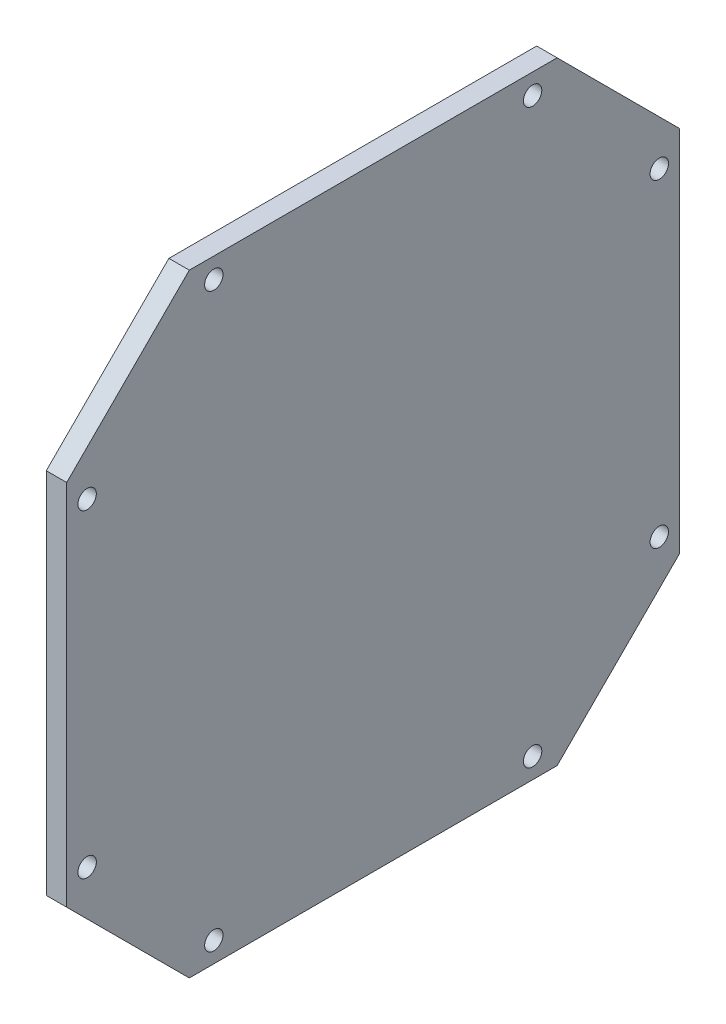
ISO-10303-21;
HEADER;
FILE_DESCRIPTION(('STEP AP214'),'2;1');
FILE_NAME('part.step','',(''),(''),'','','');
FILE_SCHEMA(('AUTOMOTIVE_DESIGN { 1 0 10303 214 1 1 1 1 }'));
ENDSEC;
DATA;
#1=APPLICATION_CONTEXT('core data for automotive mechanical design processes');
#2=APPLICATION_PROTOCOL_DEFINITION('international standard','automotive_design',2000,#1);
#3=PRODUCT_CONTEXT('',#1,'mechanical');
#4=PRODUCT('Part','Part','',(#3));
#5=PRODUCT_RELATED_PRODUCT_CATEGORY('part','',(#4));
#6=PRODUCT_DEFINITION_FORMATION('','',#4);
#7=PRODUCT_DEFINITION_CONTEXT('part definition',#1,'design');
#8=PRODUCT_DEFINITION('design','',#6,#7);
#9=PRODUCT_DEFINITION_SHAPE('','',#8);
#10=(LENGTH_UNIT() NAMED_UNIT(*) SI_UNIT(.MILLI.,.METRE.));
#11=(NAMED_UNIT(*) PLANE_ANGLE_UNIT() SI_UNIT($,.RADIAN.));
#12=(NAMED_UNIT(*) SI_UNIT($,.STERADIAN.) SOLID_ANGLE_UNIT());
#13=UNCERTAINTY_MEASURE_WITH_UNIT(LENGTH_MEASURE(1.E-05),#10,'distance_accuracy_value','');
#14=(GEOMETRIC_REPRESENTATION_CONTEXT(3) GLOBAL_UNCERTAINTY_ASSIGNED_CONTEXT((#13)) GLOBAL_UNIT_ASSIGNED_CONTEXT((#10,
#11,#12)) REPRESENTATION_CONTEXT('',''));
#15=CARTESIAN_POINT('',(0.,0.,0.));
#16=DIRECTION('',(0.,0.,1.));
#17=DIRECTION('',(1.,0.,0.));
#18=AXIS2_PLACEMENT_3D('',#15,#16,#17);
#19=CARTESIAN_POINT('',(10.,0.,0.));
#20=DIRECTION('',(-1.,0.,0.));
#21=DIRECTION('',(0.,0.,1.));
#22=AXIS2_PLACEMENT_3D('',#19,#20,#21);
#23=PLANE('',#22);
#24=DIRECTION('',(0.,-1.,0.));
#25=VECTOR('',#24,1.);
#26=CARTESIAN_POINT('',(10.,-90.,150.));
#27=LINE('',#26,#25);
#28=CARTESIAN_POINT('',(10.,90.,150.));
#29=VERTEX_POINT('',#28);
#30=CARTESIAN_POINT('',(10.,-90.,150.));
#31=VERTEX_POINT('',#30);
#32=EDGE_CURVE('E170',#29,#31,#27,.T.);
#33=ORIENTED_EDGE('',*,*,#32,.T.);
#34=DIRECTION('',(0.,-0.707106781186547,-0.707106781186547));
#35=VECTOR('',#34,1.);
#36=CARTESIAN_POINT('',(10.,-150.,90.));
#37=LINE('',#36,#35);
#38=CARTESIAN_POINT('',(10.,-150.,90.));
#39=VERTEX_POINT('',#38);
#40=EDGE_CURVE('E106',#31,#39,#37,.T.);
#41=ORIENTED_EDGE('',*,*,#40,.T.);
#42=DIRECTION('',(0.,0.,-1.));
#43=VECTOR('',#42,1.);
#44=CARTESIAN_POINT('',(10.,-150.,90.));
#45=LINE('',#44,#43);
#46=CARTESIAN_POINT('',(10.,-150.,-90.));
#47=VERTEX_POINT('',#46);
#48=EDGE_CURVE('E191',#39,#47,#45,.T.);
#49=ORIENTED_EDGE('',*,*,#48,.T.);
#50=DIRECTION('',(0.,0.707106781186548,-0.707106781186547));
#51=VECTOR('',#50,1.);
#52=CARTESIAN_POINT('',(10.,-150.,-90.));
#53=LINE('',#52,#51);
#54=CARTESIAN_POINT('',(10.,-90.,-150.));
#55=VERTEX_POINT('',#54);
#56=EDGE_CURVE('E205',#47,#55,#53,.T.);
#57=ORIENTED_EDGE('',*,*,#56,.T.);
#58=DIRECTION('',(0.,1.,0.));
#59=VECTOR('',#58,1.);
#60=CARTESIAN_POINT('',(10.,-90.,-150.));
#61=LINE('',#60,#59);
#62=CARTESIAN_POINT('',(10.,90.,-150.));
#63=VERTEX_POINT('',#62);
#64=EDGE_CURVE('E125',#55,#63,#61,.T.);
#65=ORIENTED_EDGE('',*,*,#64,.T.);
#66=DIRECTION('',(0.,0.707106781186547,0.707106781186547));
#67=VECTOR('',#66,1.);
#68=CARTESIAN_POINT('',(10.,90.,-150.));
#69=LINE('',#68,#67);
#70=CARTESIAN_POINT('',(10.,150.,-90.));
#71=VERTEX_POINT('',#70);
#72=EDGE_CURVE('E119',#63,#71,#69,.T.);
#73=ORIENTED_EDGE('',*,*,#72,.T.);
#74=DIRECTION('',(0.,0.,1.));
#75=VECTOR('',#74,1.);
#76=CARTESIAN_POINT('',(10.,150.,90.));
#77=LINE('',#76,#75);
#78=CARTESIAN_POINT('',(10.,150.,90.));
#79=VERTEX_POINT('',#78);
#80=EDGE_CURVE('E123',#71,#79,#77,.T.);
#81=ORIENTED_EDGE('',*,*,#80,.T.);
#82=DIRECTION('',(0.,-0.707106781186547,0.707106781186547));
#83=VECTOR('',#82,1.);
#84=CARTESIAN_POINT('',(10.,90.,150.));
#85=LINE('',#84,#83);
#86=EDGE_CURVE('E63',#79,#29,#85,.T.);
#87=ORIENTED_EDGE('',*,*,#86,.T.);
#88=EDGE_LOOP('',(#33,#41,#49,#57,#65,#73,#81,#87));
#89=FACE_BOUND('',#88,.T.);
#90=CARTESIAN_POINT('',(10.,-78.,140.));
#91=DIRECTION('',(1.,0.,0.));
#92=DIRECTION('',(0.,0.,-1.));
#93=AXIS2_PLACEMENT_3D('',#90,#91,#92);
#94=CIRCLE('',#93,4.50000000000001);
#95=CARTESIAN_POINT('',(10.,-78.,135.5));
#96=VERTEX_POINT('',#95);
#97=EDGE_CURVE('E152',#96,#96,#94,.T.);
#98=ORIENTED_EDGE('',*,*,#97,.F.);
#99=EDGE_LOOP('',(#98));
#100=FACE_BOUND('',#99,.T.);
#101=CARTESIAN_POINT('',(10.,-140.,78.));
#102=DIRECTION('',(1.,0.,0.));
#103=DIRECTION('',(0.,0.,-1.));
#104=AXIS2_PLACEMENT_3D('',#101,#102,#103);
#105=CIRCLE('',#104,4.49999999999999);
#106=CARTESIAN_POINT('',(10.,-140.,73.5));
#107=VERTEX_POINT('',#106);
#108=EDGE_CURVE('E219',#107,#107,#105,.T.);
#109=ORIENTED_EDGE('',*,*,#108,.F.);
#110=EDGE_LOOP('',(#109));
#111=FACE_BOUND('',#110,.T.);
#112=CARTESIAN_POINT('',(10.,-78.,-140.));
#113=DIRECTION('',(1.,0.,0.));
#114=DIRECTION('',(0.,0.,1.));
#115=AXIS2_PLACEMENT_3D('',#112,#113,#114);
#116=CIRCLE('',#115,4.50000000000001);
#117=CARTESIAN_POINT('',(10.,-78.,-135.5));
#118=VERTEX_POINT('',#117);
#119=EDGE_CURVE('E227',#118,#118,#116,.T.);
#120=ORIENTED_EDGE('',*,*,#119,.F.);
#121=EDGE_LOOP('',(#120));
#122=FACE_BOUND('',#121,.T.);
#123=CARTESIAN_POINT('',(10.,-140.,-78.));
#124=DIRECTION('',(1.,0.,0.));
#125=DIRECTION('',(0.,0.,1.));
#126=AXIS2_PLACEMENT_3D('',#123,#124,#125);
#127=CIRCLE('',#126,4.49999999999999);
#128=CARTESIAN_POINT('',(10.,-140.,-73.5));
#129=VERTEX_POINT('',#128);
#130=EDGE_CURVE('E235',#129,#129,#127,.T.);
#131=ORIENTED_EDGE('',*,*,#130,.F.);
#132=EDGE_LOOP('',(#131));
#133=FACE_BOUND('',#132,.T.);
#134=CARTESIAN_POINT('',(10.,78.,-140.));
#135=DIRECTION('',(1.,0.,0.));
#136=DIRECTION('',(0.,0.,-1.));
#137=AXIS2_PLACEMENT_3D('',#134,#135,#136);
#138=CIRCLE('',#137,4.50000000000001);
#139=CARTESIAN_POINT('',(10.,78.,-144.5));
#140=VERTEX_POINT('',#139);
#141=EDGE_CURVE('E243',#140,#140,#138,.T.);
#142=ORIENTED_EDGE('',*,*,#141,.F.);
#143=EDGE_LOOP('',(#142));
#144=FACE_BOUND('',#143,.T.);
#145=CARTESIAN_POINT('',(10.,140.,-78.));
#146=DIRECTION('',(1.,0.,0.));
#147=DIRECTION('',(0.,0.,-1.));
#148=AXIS2_PLACEMENT_3D('',#145,#146,#147);
#149=CIRCLE('',#148,4.49999999999999);
#150=CARTESIAN_POINT('',(10.,140.,-82.5));
#151=VERTEX_POINT('',#150);
#152=EDGE_CURVE('E251',#151,#151,#149,.T.);
#153=ORIENTED_EDGE('',*,*,#152,.F.);
#154=EDGE_LOOP('',(#153));
#155=FACE_BOUND('',#154,.T.);
#156=CARTESIAN_POINT('',(10.,140.,78.));
#157=DIRECTION('',(1.,0.,0.));
#158=DIRECTION('',(0.,0.,1.));
#159=AXIS2_PLACEMENT_3D('',#156,#157,#158);
#160=CIRCLE('',#159,4.49999999999999);
#161=CARTESIAN_POINT('',(10.,140.,82.5));
#162=VERTEX_POINT('',#161);
#163=EDGE_CURVE('E259',#162,#162,#160,.T.);
#164=ORIENTED_EDGE('',*,*,#163,.F.);
#165=EDGE_LOOP('',(#164));
#166=FACE_BOUND('',#165,.T.);
#167=CARTESIAN_POINT('',(10.,78.,140.));
#168=DIRECTION('',(1.,0.,0.));
#169=DIRECTION('',(0.,0.,1.));
#170=AXIS2_PLACEMENT_3D('',#167,#168,#169);
#171=CIRCLE('',#170,4.50000000000001);
#172=CARTESIAN_POINT('',(10.,78.,144.5));
#173=VERTEX_POINT('',#172);
#174=EDGE_CURVE('E267',#173,#173,#171,.T.);
#175=ORIENTED_EDGE('',*,*,#174,.F.);
#176=EDGE_LOOP('',(#175));
#177=FACE_BOUND('',#176,.T.);
#178=ADVANCED_FACE('F45',(#89,#100,#111,#122,#133,#144,#155,#166,#177),#23,.F.);
#179=CARTESIAN_POINT('',(0.,0.,0.));
#180=DIRECTION('',(-1.,0.,0.));
#181=DIRECTION('',(0.,0.,1.));
#182=AXIS2_PLACEMENT_3D('',#179,#180,#181);
#183=PLANE('',#182);
#184=CARTESIAN_POINT('',(0.,140.,78.));
#185=DIRECTION('',(1.,0.,0.));
#186=DIRECTION('',(0.,0.,1.));
#187=AXIS2_PLACEMENT_3D('',#184,#185,#186);
#188=CIRCLE('',#187,4.49999999999999);
#189=CARTESIAN_POINT('',(0.,140.,82.5));
#190=VERTEX_POINT('',#189);
#191=EDGE_CURVE('E263',#190,#190,#188,.T.);
#192=ORIENTED_EDGE('',*,*,#191,.T.);
#193=EDGE_LOOP('',(#192));
#194=FACE_BOUND('',#193,.T.);
#195=CARTESIAN_POINT('',(0.,78.,-140.));
#196=DIRECTION('',(1.,0.,0.));
#197=DIRECTION('',(0.,0.,-1.));
#198=AXIS2_PLACEMENT_3D('',#195,#196,#197);
#199=CIRCLE('',#198,4.50000000000001);
#200=CARTESIAN_POINT('',(0.,78.,-144.5));
#201=VERTEX_POINT('',#200);
#202=EDGE_CURVE('E247',#201,#201,#199,.T.);
#203=ORIENTED_EDGE('',*,*,#202,.T.);
#204=EDGE_LOOP('',(#203));
#205=FACE_BOUND('',#204,.T.);
#206=CARTESIAN_POINT('',(0.,-78.,-140.));
#207=DIRECTION('',(1.,0.,0.));
#208=DIRECTION('',(0.,0.,1.));
#209=AXIS2_PLACEMENT_3D('',#206,#207,#208);
#210=CIRCLE('',#209,4.50000000000001);
#211=CARTESIAN_POINT('',(0.,-78.,-135.5));
#212=VERTEX_POINT('',#211);
#213=EDGE_CURVE('E231',#212,#212,#210,.T.);
#214=ORIENTED_EDGE('',*,*,#213,.T.);
#215=EDGE_LOOP('',(#214));
#216=FACE_BOUND('',#215,.T.);
#217=CARTESIAN_POINT('',(0.,-78.,140.));
#218=DIRECTION('',(1.,0.,0.));
#219=DIRECTION('',(0.,0.,-1.));
#220=AXIS2_PLACEMENT_3D('',#217,#218,#219);
#221=CIRCLE('',#220,4.50000000000001);
#222=CARTESIAN_POINT('',(0.,-78.,135.5));
#223=VERTEX_POINT('',#222);
#224=EDGE_CURVE('E215',#223,#223,#221,.T.);
#225=ORIENTED_EDGE('',*,*,#224,.T.);
#226=EDGE_LOOP('',(#225));
#227=FACE_BOUND('',#226,.T.);
#228=DIRECTION('',(0.,-1.,0.));
#229=VECTOR('',#228,1.);
#230=CARTESIAN_POINT('',(0.,-90.,150.));
#231=LINE('',#230,#229);
#232=CARTESIAN_POINT('',(0.,90.,150.));
#233=VERTEX_POINT('',#232);
#234=CARTESIAN_POINT('',(0.,-90.,150.));
#235=VERTEX_POINT('',#234);
#236=EDGE_CURVE('E147',#233,#235,#231,.T.);
#237=ORIENTED_EDGE('',*,*,#236,.F.);
#238=DIRECTION('',(0.,-0.707106781186547,0.707106781186547));
#239=VECTOR('',#238,1.);
#240=CARTESIAN_POINT('',(0.,90.,150.));
#241=LINE('',#240,#239);
#242=CARTESIAN_POINT('',(0.,150.,90.));
#243=VERTEX_POINT('',#242);
#244=EDGE_CURVE('E98',#243,#233,#241,.T.);
#245=ORIENTED_EDGE('',*,*,#244,.F.);
#246=DIRECTION('',(0.,0.,1.));
#247=VECTOR('',#246,1.);
#248=CARTESIAN_POINT('',(0.,150.,90.));
#249=LINE('',#248,#247);
#250=CARTESIAN_POINT('',(0.,150.,-90.));
#251=VERTEX_POINT('',#250);
#252=EDGE_CURVE('E92',#251,#243,#249,.T.);
#253=ORIENTED_EDGE('',*,*,#252,.F.);
#254=DIRECTION('',(0.,0.707106781186547,0.707106781186547));
#255=VECTOR('',#254,1.);
#256=CARTESIAN_POINT('',(0.,90.,-150.));
#257=LINE('',#256,#255);
#258=CARTESIAN_POINT('',(0.,90.,-150.));
#259=VERTEX_POINT('',#258);
#260=EDGE_CURVE('E134',#259,#251,#257,.T.);
#261=ORIENTED_EDGE('',*,*,#260,.F.);
#262=DIRECTION('',(0.,1.,0.));
#263=VECTOR('',#262,1.);
#264=CARTESIAN_POINT('',(0.,-90.,-150.));
#265=LINE('',#264,#263);
#266=CARTESIAN_POINT('',(0.,-90.,-150.));
#267=VERTEX_POINT('',#266);
#268=EDGE_CURVE('E161',#267,#259,#265,.T.);
#269=ORIENTED_EDGE('',*,*,#268,.F.);
#270=DIRECTION('',(0.,0.707106781186548,-0.707106781186547));
#271=VECTOR('',#270,1.);
#272=CARTESIAN_POINT('',(0.,-150.,-90.));
#273=LINE('',#272,#271);
#274=CARTESIAN_POINT('',(0.,-150.,-90.));
#275=VERTEX_POINT('',#274);
#276=EDGE_CURVE('E158',#275,#267,#273,.T.);
#277=ORIENTED_EDGE('',*,*,#276,.F.);
#278=DIRECTION('',(0.,0.,-1.));
#279=VECTOR('',#278,1.);
#280=CARTESIAN_POINT('',(0.,-150.,90.));
#281=LINE('',#280,#279);
#282=CARTESIAN_POINT('',(0.,-150.,90.));
#283=VERTEX_POINT('',#282);
#284=EDGE_CURVE('E155',#283,#275,#281,.T.);
#285=ORIENTED_EDGE('',*,*,#284,.F.);
#286=DIRECTION('',(0.,-0.707106781186547,-0.707106781186547));
#287=VECTOR('',#286,1.);
#288=CARTESIAN_POINT('',(0.,-150.,90.));
#289=LINE('',#288,#287);
#290=EDGE_CURVE('E151',#235,#283,#289,.T.);
#291=ORIENTED_EDGE('',*,*,#290,.F.);
#292=EDGE_LOOP('',(#237,#245,#253,#261,#269,#277,#285,#291));
#293=FACE_BOUND('',#292,.T.);
#294=CARTESIAN_POINT('',(0.,-140.,78.));
#295=DIRECTION('',(1.,0.,0.));
#296=DIRECTION('',(0.,0.,-1.));
#297=AXIS2_PLACEMENT_3D('',#294,#295,#296);
#298=CIRCLE('',#297,4.49999999999999);
#299=CARTESIAN_POINT('',(0.,-140.,73.5));
#300=VERTEX_POINT('',#299);
#301=EDGE_CURVE('E223',#300,#300,#298,.T.);
#302=ORIENTED_EDGE('',*,*,#301,.T.);
#303=EDGE_LOOP('',(#302));
#304=FACE_BOUND('',#303,.T.);
#305=CARTESIAN_POINT('',(0.,-140.,-78.));
#306=DIRECTION('',(1.,0.,0.));
#307=DIRECTION('',(0.,0.,1.));
#308=AXIS2_PLACEMENT_3D('',#305,#306,#307);
#309=CIRCLE('',#308,4.49999999999999);
#310=CARTESIAN_POINT('',(0.,-140.,-73.5));
#311=VERTEX_POINT('',#310);
#312=EDGE_CURVE('E239',#311,#311,#309,.T.);
#313=ORIENTED_EDGE('',*,*,#312,.T.);
#314=EDGE_LOOP('',(#313));
#315=FACE_BOUND('',#314,.T.);
#316=CARTESIAN_POINT('',(0.,140.,-78.));
#317=DIRECTION('',(1.,0.,0.));
#318=DIRECTION('',(0.,0.,-1.));
#319=AXIS2_PLACEMENT_3D('',#316,#317,#318);
#320=CIRCLE('',#319,4.49999999999999);
#321=CARTESIAN_POINT('',(0.,140.,-82.5));
#322=VERTEX_POINT('',#321);
#323=EDGE_CURVE('E255',#322,#322,#320,.T.);
#324=ORIENTED_EDGE('',*,*,#323,.T.);
#325=EDGE_LOOP('',(#324));
#326=FACE_BOUND('',#325,.T.);
#327=CARTESIAN_POINT('',(0.,78.,140.));
#328=DIRECTION('',(1.,0.,0.));
#329=DIRECTION('',(0.,0.,1.));
#330=AXIS2_PLACEMENT_3D('',#327,#328,#329);
#331=CIRCLE('',#330,4.50000000000001);
#332=CARTESIAN_POINT('',(0.,78.,144.5));
#333=VERTEX_POINT('',#332);
#334=EDGE_CURVE('E271',#333,#333,#331,.T.);
#335=ORIENTED_EDGE('',*,*,#334,.T.);
#336=EDGE_LOOP('',(#335));
#337=FACE_BOUND('',#336,.T.);
#338=ADVANCED_FACE('F195',(#194,#205,#216,#227,#293,#304,#315,#326,#337),#183,.T.);
#339=CARTESIAN_POINT('',(10.,-90.,150.));
#340=DIRECTION('',(0.,0.,-1.));
#341=DIRECTION('',(-1.,0.,0.));
#342=AXIS2_PLACEMENT_3D('',#339,#340,#341);
#343=PLANE('',#342);
#344=ORIENTED_EDGE('',*,*,#236,.T.);
#345=DIRECTION('',(-1.,0.,0.));
#346=VECTOR('',#345,1.);
#347=CARTESIAN_POINT('',(10.,-90.,150.));
#348=LINE('',#347,#346);
#349=EDGE_CURVE('E11',#31,#235,#348,.T.);
#350=ORIENTED_EDGE('',*,*,#349,.F.);
#351=ORIENTED_EDGE('',*,*,#32,.F.);
#352=DIRECTION('',(-1.,0.,0.));
#353=VECTOR('',#352,1.);
#354=CARTESIAN_POINT('',(10.,90.,150.));
#355=LINE('',#354,#353);
#356=EDGE_CURVE('E143',#29,#233,#355,.T.);
#357=ORIENTED_EDGE('',*,*,#356,.T.);
#358=EDGE_LOOP('',(#344,#350,#351,#357));
#359=FACE_BOUND('',#358,.T.);
#360=ADVANCED_FACE('F47',(#359),#343,.F.);
#361=CARTESIAN_POINT('',(10.,-150.,90.));
#362=DIRECTION('',(0.,0.707106781186548,-0.707106781186548));
#363=DIRECTION('',(0.,0.707106781186548,0.707106781186548));
#364=AXIS2_PLACEMENT_3D('',#361,#362,#363);
#365=PLANE('',#364);
#366=ORIENTED_EDGE('',*,*,#290,.T.);
#367=DIRECTION('',(-1.,0.,0.));
#368=VECTOR('',#367,1.);
#369=CARTESIAN_POINT('',(10.,-150.,90.));
#370=LINE('',#369,#368);
#371=EDGE_CURVE('E55',#39,#283,#370,.T.);
#372=ORIENTED_EDGE('',*,*,#371,.F.);
#373=ORIENTED_EDGE('',*,*,#40,.F.);
#374=ORIENTED_EDGE('',*,*,#349,.T.);
#375=EDGE_LOOP('',(#366,#372,#373,#374));
#376=FACE_BOUND('',#375,.T.);
#377=ADVANCED_FACE('F305',(#376),#365,.F.);
#378=CARTESIAN_POINT('',(10.,-150.,90.));
#379=DIRECTION('',(0.,1.,0.));
#380=DIRECTION('',(0.,0.,1.));
#381=AXIS2_PLACEMENT_3D('',#378,#379,#380);
#382=PLANE('',#381);
#383=ORIENTED_EDGE('',*,*,#284,.T.);
#384=DIRECTION('',(-1.,0.,0.));
#385=VECTOR('',#384,1.);
#386=CARTESIAN_POINT('',(10.,-150.,-90.));
#387=LINE('',#386,#385);
#388=EDGE_CURVE('E181',#47,#275,#387,.T.);
#389=ORIENTED_EDGE('',*,*,#388,.F.);
#390=ORIENTED_EDGE('',*,*,#48,.F.);
#391=ORIENTED_EDGE('',*,*,#371,.T.);
#392=EDGE_LOOP('',(#383,#389,#390,#391));
#393=FACE_BOUND('',#392,.T.);
#394=ADVANCED_FACE('F189',(#393),#382,.F.);
#395=CARTESIAN_POINT('',(10.,-150.,-90.));
#396=DIRECTION('',(0.,0.707106781186547,0.707106781186548));
#397=DIRECTION('',(0.,-0.707106781186548,0.707106781186547));
#398=AXIS2_PLACEMENT_3D('',#395,#396,#397);
#399=PLANE('',#398);
#400=ORIENTED_EDGE('',*,*,#276,.T.);
#401=DIRECTION('',(-1.,0.,0.));
#402=VECTOR('',#401,1.);
#403=CARTESIAN_POINT('',(10.,-90.,-150.));
#404=LINE('',#403,#402);
#405=EDGE_CURVE('E177',#55,#267,#404,.T.);
#406=ORIENTED_EDGE('',*,*,#405,.F.);
#407=ORIENTED_EDGE('',*,*,#56,.F.);
#408=ORIENTED_EDGE('',*,*,#388,.T.);
#409=EDGE_LOOP('',(#400,#406,#407,#408));
#410=FACE_BOUND('',#409,.T.);
#411=ADVANCED_FACE('F200',(#410),#399,.F.);
#412=CARTESIAN_POINT('',(10.,-90.,-150.));
#413=DIRECTION('',(0.,0.,1.));
#414=DIRECTION('',(0.,-1.,0.));
#415=AXIS2_PLACEMENT_3D('',#412,#413,#414);
#416=PLANE('',#415);
#417=ORIENTED_EDGE('',*,*,#268,.T.);
#418=DIRECTION('',(-1.,0.,0.));
#419=VECTOR('',#418,1.);
#420=CARTESIAN_POINT('',(10.,90.,-150.));
#421=LINE('',#420,#419);
#422=EDGE_CURVE('E136',#63,#259,#421,.T.);
#423=ORIENTED_EDGE('',*,*,#422,.F.);
#424=ORIENTED_EDGE('',*,*,#64,.F.);
#425=ORIENTED_EDGE('',*,*,#405,.T.);
#426=EDGE_LOOP('',(#417,#423,#424,#425));
#427=FACE_BOUND('',#426,.T.);
#428=ADVANCED_FACE('F203',(#427),#416,.F.);
#429=CARTESIAN_POINT('',(10.,90.,-150.));
#430=DIRECTION('',(0.,-0.707106781186548,0.707106781186548));
#431=DIRECTION('',(0.,-0.707106781186548,-0.707106781186548));
#432=AXIS2_PLACEMENT_3D('',#429,#430,#431);
#433=PLANE('',#432);
#434=ORIENTED_EDGE('',*,*,#260,.T.);
#435=DIRECTION('',(-1.,0.,0.));
#436=VECTOR('',#435,1.);
#437=CARTESIAN_POINT('',(10.,150.,-90.));
#438=LINE('',#437,#436);
#439=EDGE_CURVE('E131',#71,#251,#438,.T.);
#440=ORIENTED_EDGE('',*,*,#439,.F.);
#441=ORIENTED_EDGE('',*,*,#72,.F.);
#442=ORIENTED_EDGE('',*,*,#422,.T.);
#443=EDGE_LOOP('',(#434,#440,#441,#442));
#444=FACE_BOUND('',#443,.T.);
#445=ADVANCED_FACE('F132',(#444),#433,.F.);
#446=CARTESIAN_POINT('',(10.,150.,90.));
#447=DIRECTION('',(0.,-1.,0.));
#448=DIRECTION('',(0.,0.,-1.));
#449=AXIS2_PLACEMENT_3D('',#446,#447,#448);
#450=PLANE('',#449);
#451=ORIENTED_EDGE('',*,*,#252,.T.);
#452=DIRECTION('',(-1.,0.,0.));
#453=VECTOR('',#452,1.);
#454=CARTESIAN_POINT('',(10.,150.,90.));
#455=LINE('',#454,#453);
#456=EDGE_CURVE('E137',#79,#243,#455,.T.);
#457=ORIENTED_EDGE('',*,*,#456,.F.);
#458=ORIENTED_EDGE('',*,*,#80,.F.);
#459=ORIENTED_EDGE('',*,*,#439,.T.);
#460=EDGE_LOOP('',(#451,#457,#458,#459));
#461=FACE_BOUND('',#460,.T.);
#462=ADVANCED_FACE('F139',(#461),#450,.F.);
#463=CARTESIAN_POINT('',(10.,90.,150.));
#464=DIRECTION('',(0.,-0.707106781186548,-0.707106781186548));
#465=DIRECTION('',(0.,0.707106781186548,-0.707106781186548));
#466=AXIS2_PLACEMENT_3D('',#463,#464,#465);
#467=PLANE('',#466);
#468=ORIENTED_EDGE('',*,*,#244,.T.);
#469=ORIENTED_EDGE('',*,*,#356,.F.);
#470=ORIENTED_EDGE('',*,*,#86,.F.);
#471=ORIENTED_EDGE('',*,*,#456,.T.);
#472=EDGE_LOOP('',(#468,#469,#470,#471));
#473=FACE_BOUND('',#472,.T.);
#474=ADVANCED_FACE('F293',(#473),#467,.F.);
#475=CARTESIAN_POINT('',(10.,-78.,140.));
#476=DIRECTION('',(-1.,0.,0.));
#477=DIRECTION('',(0.,0.,1.));
#478=AXIS2_PLACEMENT_3D('',#475,#476,#477);
#479=CYLINDRICAL_SURFACE('',#478,4.50000000000001);
#480=ORIENTED_EDGE('',*,*,#97,.T.);
#481=EDGE_LOOP('',(#480));
#482=FACE_BOUND('',#481,.T.);
#483=ORIENTED_EDGE('',*,*,#224,.F.);
#484=EDGE_LOOP('',(#483));
#485=FACE_BOUND('',#484,.T.);
#486=ADVANCED_FACE('F290',(#482,#485),#479,.F.);
#487=CARTESIAN_POINT('',(10.,-140.,78.));
#488=DIRECTION('',(-1.,0.,0.));
#489=DIRECTION('',(0.,0.,1.));
#490=AXIS2_PLACEMENT_3D('',#487,#488,#489);
#491=CYLINDRICAL_SURFACE('',#490,4.49999999999999);
#492=ORIENTED_EDGE('',*,*,#108,.T.);
#493=EDGE_LOOP('',(#492));
#494=FACE_BOUND('',#493,.T.);
#495=ORIENTED_EDGE('',*,*,#301,.F.);
#496=EDGE_LOOP('',(#495));
#497=FACE_BOUND('',#496,.T.);
#498=ADVANCED_FACE('F368',(#494,#497),#491,.F.);
#499=CARTESIAN_POINT('',(10.,-78.,-140.));
#500=DIRECTION('',(-1.,0.,0.));
#501=DIRECTION('',(0.,0.,1.));
#502=AXIS2_PLACEMENT_3D('',#499,#500,#501);
#503=CYLINDRICAL_SURFACE('',#502,4.50000000000001);
#504=ORIENTED_EDGE('',*,*,#119,.T.);
#505=EDGE_LOOP('',(#504));
#506=FACE_BOUND('',#505,.T.);
#507=ORIENTED_EDGE('',*,*,#213,.F.);
#508=EDGE_LOOP('',(#507));
#509=FACE_BOUND('',#508,.T.);
#510=ADVANCED_FACE('F376',(#506,#509),#503,.F.);
#511=CARTESIAN_POINT('',(10.,-140.,-78.));
#512=DIRECTION('',(-1.,0.,0.));
#513=DIRECTION('',(0.,0.,1.));
#514=AXIS2_PLACEMENT_3D('',#511,#512,#513);
#515=CYLINDRICAL_SURFACE('',#514,4.49999999999999);
#516=ORIENTED_EDGE('',*,*,#130,.T.);
#517=EDGE_LOOP('',(#516));
#518=FACE_BOUND('',#517,.T.);
#519=ORIENTED_EDGE('',*,*,#312,.F.);
#520=EDGE_LOOP('',(#519));
#521=FACE_BOUND('',#520,.T.);
#522=ADVANCED_FACE('F384',(#518,#521),#515,.F.);
#523=CARTESIAN_POINT('',(10.,78.,-140.));
#524=DIRECTION('',(-1.,0.,0.));
#525=DIRECTION('',(0.,0.,1.));
#526=AXIS2_PLACEMENT_3D('',#523,#524,#525);
#527=CYLINDRICAL_SURFACE('',#526,4.50000000000001);
#528=ORIENTED_EDGE('',*,*,#141,.T.);
#529=EDGE_LOOP('',(#528));
#530=FACE_BOUND('',#529,.T.);
#531=ORIENTED_EDGE('',*,*,#202,.F.);
#532=EDGE_LOOP('',(#531));
#533=FACE_BOUND('',#532,.T.);
#534=ADVANCED_FACE('F393',(#530,#533),#527,.F.);
#535=CARTESIAN_POINT('',(10.,140.,-78.));
#536=DIRECTION('',(-1.,0.,0.));
#537=DIRECTION('',(0.,0.,1.));
#538=AXIS2_PLACEMENT_3D('',#535,#536,#537);
#539=CYLINDRICAL_SURFACE('',#538,4.49999999999999);
#540=ORIENTED_EDGE('',*,*,#152,.T.);
#541=EDGE_LOOP('',(#540));
#542=FACE_BOUND('',#541,.T.);
#543=ORIENTED_EDGE('',*,*,#323,.F.);
#544=EDGE_LOOP('',(#543));
#545=FACE_BOUND('',#544,.T.);
#546=ADVANCED_FACE('F402',(#542,#545),#539,.F.);
#547=CARTESIAN_POINT('',(10.,140.,78.));
#548=DIRECTION('',(-1.,0.,0.));
#549=DIRECTION('',(0.,0.,1.));
#550=AXIS2_PLACEMENT_3D('',#547,#548,#549);
#551=CYLINDRICAL_SURFACE('',#550,4.49999999999999);
#552=ORIENTED_EDGE('',*,*,#163,.T.);
#553=EDGE_LOOP('',(#552));
#554=FACE_BOUND('',#553,.T.);
#555=ORIENTED_EDGE('',*,*,#191,.F.);
#556=EDGE_LOOP('',(#555));
#557=FACE_BOUND('',#556,.T.);
#558=ADVANCED_FACE('F411',(#554,#557),#551,.F.);
#559=CARTESIAN_POINT('',(10.,78.,140.));
#560=DIRECTION('',(-1.,0.,0.));
#561=DIRECTION('',(0.,0.,1.));
#562=AXIS2_PLACEMENT_3D('',#559,#560,#561);
#563=CYLINDRICAL_SURFACE('',#562,4.50000000000001);
#564=ORIENTED_EDGE('',*,*,#174,.T.);
#565=EDGE_LOOP('',(#564));
#566=FACE_BOUND('',#565,.T.);
#567=ORIENTED_EDGE('',*,*,#334,.F.);
#568=EDGE_LOOP('',(#567));
#569=FACE_BOUND('',#568,.T.);
#570=ADVANCED_FACE('F279',(#566,#569),#563,.F.);
#571=CLOSED_SHELL('',(#178,#338,#360,#377,#394,#411,#428,#445,#462,#474,#486,#498,#510,#522,
#534,#546,#558,#570));
#572=MANIFOLD_SOLID_BREP('B2',#571);
#573=ADVANCED_BREP_SHAPE_REPRESENTATION('',(#18,#572),#14);
#574=SHAPE_DEFINITION_REPRESENTATION(#9,#573);
ENDSEC;
END-ISO-10303-21;
